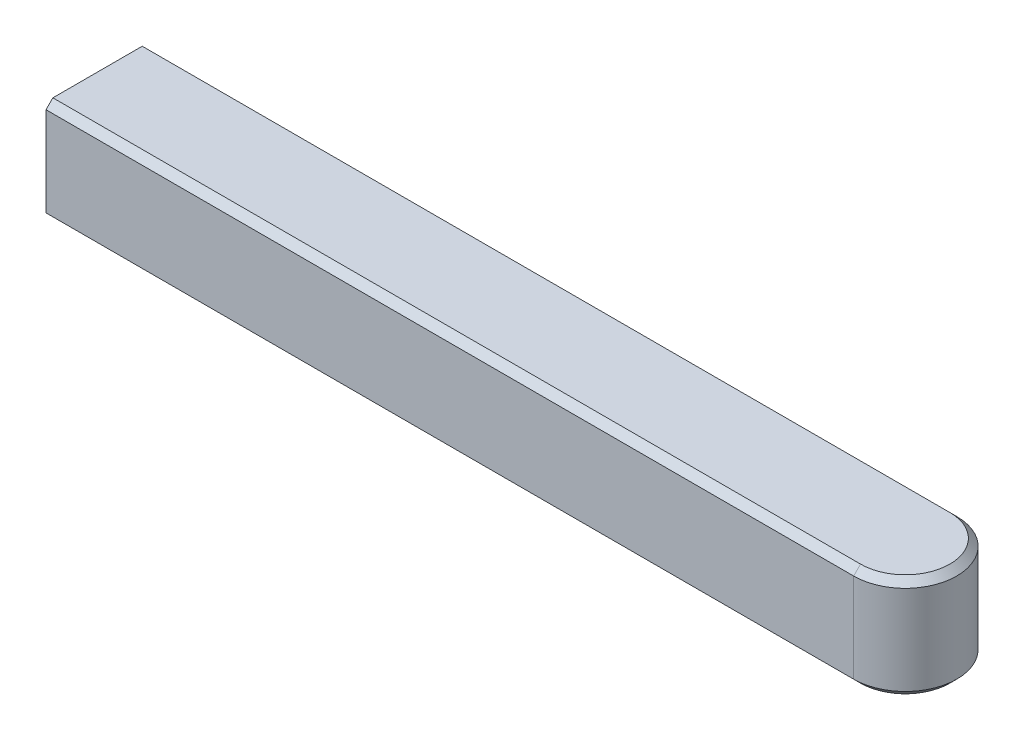
ISO-10303-21;
HEADER;
FILE_DESCRIPTION(('STEP AP214'),'2;1');
FILE_NAME('part.step','',(''),(''),'','','');
FILE_SCHEMA(('AUTOMOTIVE_DESIGN { 1 0 10303 214 1 1 1 1 }'));
ENDSEC;
DATA;
#1=APPLICATION_CONTEXT('core data for automotive mechanical design processes');
#2=APPLICATION_PROTOCOL_DEFINITION('international standard','automotive_design',2000,#1);
#3=PRODUCT_CONTEXT('',#1,'mechanical');
#4=PRODUCT('Part','Part','',(#3));
#5=PRODUCT_RELATED_PRODUCT_CATEGORY('part','',(#4));
#6=PRODUCT_DEFINITION_FORMATION('','',#4);
#7=PRODUCT_DEFINITION_CONTEXT('part definition',#1,'design');
#8=PRODUCT_DEFINITION('design','',#6,#7);
#9=PRODUCT_DEFINITION_SHAPE('','',#8);
#10=(LENGTH_UNIT() NAMED_UNIT(*) SI_UNIT(.MILLI.,.METRE.));
#11=(NAMED_UNIT(*) PLANE_ANGLE_UNIT() SI_UNIT($,.RADIAN.));
#12=(NAMED_UNIT(*) SI_UNIT($,.STERADIAN.) SOLID_ANGLE_UNIT());
#13=UNCERTAINTY_MEASURE_WITH_UNIT(LENGTH_MEASURE(1.E-05),#10,'distance_accuracy_value','');
#14=(GEOMETRIC_REPRESENTATION_CONTEXT(3) GLOBAL_UNCERTAINTY_ASSIGNED_CONTEXT((#13)) GLOBAL_UNIT_ASSIGNED_CONTEXT((#10,
#11,#12)) REPRESENTATION_CONTEXT('',''));
#15=CARTESIAN_POINT('',(0.,0.,0.));
#16=DIRECTION('',(0.,0.,1.));
#17=DIRECTION('',(1.,0.,0.));
#18=AXIS2_PLACEMENT_3D('',#15,#16,#17);
#19=CARTESIAN_POINT('',(11.,0.,0.));
#20=DIRECTION('',(0.,-1.,0.));
#21=DIRECTION('',(0.,0.,-1.));
#22=AXIS2_PLACEMENT_3D('',#19,#20,#21);
#23=CYLINDRICAL_SURFACE('',#22,1.5);
#24=DIRECTION('',(0.,-1.,0.));
#25=VECTOR('',#24,1.);
#26=CARTESIAN_POINT('',(11.,3.,1.5));
#27=LINE('',#26,#25);
#28=CARTESIAN_POINT('',(11.,0.200000000000002,1.5));
#29=VERTEX_POINT('',#28);
#30=CARTESIAN_POINT('',(11.,2.8,1.5));
#31=VERTEX_POINT('',#30);
#32=EDGE_CURVE('E123',#29,#31,#27,.F.);
#33=ORIENTED_EDGE('',*,*,#32,.F.);
#34=CARTESIAN_POINT('',(11.,0.200000000000002,0.));
#35=DIRECTION('',(0.,1.,0.));
#36=DIRECTION('',(0.,0.,1.));
#37=AXIS2_PLACEMENT_3D('',#34,#35,#36);
#38=CIRCLE('',#37,1.5);
#39=CARTESIAN_POINT('',(11.,0.200000000000002,-1.5));
#40=VERTEX_POINT('',#39);
#41=EDGE_CURVE('E122',#29,#40,#38,.T.);
#42=ORIENTED_EDGE('',*,*,#41,.T.);
#43=DIRECTION('',(0.,-1.,0.));
#44=VECTOR('',#43,1.);
#45=CARTESIAN_POINT('',(11.,3.,-1.5));
#46=LINE('',#45,#44);
#47=CARTESIAN_POINT('',(11.,2.8,-1.5));
#48=VERTEX_POINT('',#47);
#49=EDGE_CURVE('E108',#48,#40,#46,.T.);
#50=ORIENTED_EDGE('',*,*,#49,.F.);
#51=CARTESIAN_POINT('',(11.,2.8,0.));
#52=DIRECTION('',(0.,1.,0.));
#53=DIRECTION('',(0.,0.,1.));
#54=AXIS2_PLACEMENT_3D('',#51,#52,#53);
#55=CIRCLE('',#54,1.5);
#56=EDGE_CURVE('E119',#48,#31,#55,.F.);
#57=ORIENTED_EDGE('',*,*,#56,.T.);
#58=EDGE_LOOP('',(#33,#42,#50,#57));
#59=FACE_BOUND('',#58,.T.);
#60=ADVANCED_FACE('F37',(#59),#23,.T.);
#61=CARTESIAN_POINT('',(-12.5,3.,-1.5));
#62=DIRECTION('',(1.,0.,0.));
#63=DIRECTION('',(0.,0.,-1.));
#64=AXIS2_PLACEMENT_3D('',#61,#62,#63);
#65=PLANE('',#64);
#66=DIRECTION('',(0.,-1.,0.));
#67=VECTOR('',#66,1.);
#68=CARTESIAN_POINT('',(-12.5,3.,-1.5));
#69=LINE('',#68,#67);
#70=CARTESIAN_POINT('',(-12.5,2.8,-1.5));
#71=VERTEX_POINT('',#70);
#72=CARTESIAN_POINT('',(-12.5,0.200000000000002,-1.5));
#73=VERTEX_POINT('',#72);
#74=EDGE_CURVE('E111',#71,#73,#69,.T.);
#75=ORIENTED_EDGE('',*,*,#74,.T.);
#76=DIRECTION('',(0.,0.707106781186548,-0.707106781186548));
#77=VECTOR('',#76,1.);
#78=CARTESIAN_POINT('',(-12.5,0.200000000000002,-1.5));
#79=LINE('',#78,#77);
#80=CARTESIAN_POINT('',(-12.5,0.,-1.3));
#81=VERTEX_POINT('',#80);
#82=EDGE_CURVE('E153',#73,#81,#79,.F.);
#83=ORIENTED_EDGE('',*,*,#82,.T.);
#84=DIRECTION('',(0.,0.,1.));
#85=VECTOR('',#84,1.);
#86=CARTESIAN_POINT('',(-12.5,0.,-1.5));
#87=LINE('',#86,#85);
#88=CARTESIAN_POINT('',(-12.5,0.,1.3));
#89=VERTEX_POINT('',#88);
#90=EDGE_CURVE('E138',#81,#89,#87,.T.);
#91=ORIENTED_EDGE('',*,*,#90,.T.);
#92=DIRECTION('',(0.,-0.707106781186548,-0.707106781186548));
#93=VECTOR('',#92,1.);
#94=CARTESIAN_POINT('',(-12.5,0.200000000000002,1.5));
#95=LINE('',#94,#93);
#96=CARTESIAN_POINT('',(-12.5,0.200000000000002,1.5));
#97=VERTEX_POINT('',#96);
#98=EDGE_CURVE('E155',#89,#97,#95,.F.);
#99=ORIENTED_EDGE('',*,*,#98,.T.);
#100=DIRECTION('',(0.,-1.,0.));
#101=VECTOR('',#100,1.);
#102=CARTESIAN_POINT('',(-12.5,3.,1.5));
#103=LINE('',#102,#101);
#104=CARTESIAN_POINT('',(-12.5,2.8,1.5));
#105=VERTEX_POINT('',#104);
#106=EDGE_CURVE('E163',#105,#97,#103,.T.);
#107=ORIENTED_EDGE('',*,*,#106,.F.);
#108=DIRECTION('',(0.,0.707106781186548,-0.707106781186548));
#109=VECTOR('',#108,1.);
#110=CARTESIAN_POINT('',(-12.5,3.,1.3));
#111=LINE('',#110,#109);
#112=CARTESIAN_POINT('',(-12.5,3.,1.3));
#113=VERTEX_POINT('',#112);
#114=EDGE_CURVE('E159',#105,#113,#111,.T.);
#115=ORIENTED_EDGE('',*,*,#114,.T.);
#116=DIRECTION('',(0.,0.,1.));
#117=VECTOR('',#116,1.);
#118=CARTESIAN_POINT('',(-12.5,3.,-1.5));
#119=LINE('',#118,#117);
#120=CARTESIAN_POINT('',(-12.5,3.,-1.3));
#121=VERTEX_POINT('',#120);
#122=EDGE_CURVE('E167',#121,#113,#119,.T.);
#123=ORIENTED_EDGE('',*,*,#122,.F.);
#124=DIRECTION('',(0.,-0.707106781186548,-0.707106781186548));
#125=VECTOR('',#124,1.);
#126=CARTESIAN_POINT('',(-12.5,3.,-1.3));
#127=LINE('',#126,#125);
#128=EDGE_CURVE('E157',#121,#71,#127,.T.);
#129=ORIENTED_EDGE('',*,*,#128,.T.);
#130=EDGE_LOOP('',(#75,#83,#91,#99,#107,#115,#123,#129));
#131=FACE_BOUND('',#130,.T.);
#132=ADVANCED_FACE('F180',(#131),#65,.F.);
#133=CARTESIAN_POINT('',(-12.5,3.,1.5));
#134=DIRECTION('',(0.,0.,-1.));
#135=DIRECTION('',(-1.,0.,0.));
#136=AXIS2_PLACEMENT_3D('',#133,#134,#135);
#137=PLANE('',#136);
#138=ORIENTED_EDGE('',*,*,#106,.T.);
#139=DIRECTION('',(1.,0.,0.));
#140=VECTOR('',#139,1.);
#141=CARTESIAN_POINT('',(-12.5,0.200000000000002,1.5));
#142=LINE('',#141,#140);
#143=EDGE_CURVE('E143',#97,#29,#142,.T.);
#144=ORIENTED_EDGE('',*,*,#143,.T.);
#145=ORIENTED_EDGE('',*,*,#32,.T.);
#146=DIRECTION('',(-1.,0.,0.));
#147=VECTOR('',#146,1.);
#148=CARTESIAN_POINT('',(-12.5,2.8,1.5));
#149=LINE('',#148,#147);
#150=EDGE_CURVE('E145',#31,#105,#149,.T.);
#151=ORIENTED_EDGE('',*,*,#150,.T.);
#152=EDGE_LOOP('',(#138,#144,#145,#151));
#153=FACE_BOUND('',#152,.T.);
#154=ADVANCED_FACE('F178',(#153),#137,.F.);
#155=CARTESIAN_POINT('',(-12.5,3.,-1.5));
#156=DIRECTION('',(0.,0.,1.));
#157=DIRECTION('',(1.,0.,0.));
#158=AXIS2_PLACEMENT_3D('',#155,#156,#157);
#159=PLANE('',#158);
#160=ORIENTED_EDGE('',*,*,#49,.T.);
#161=DIRECTION('',(-1.,0.,0.));
#162=VECTOR('',#161,1.);
#163=CARTESIAN_POINT('',(-12.5,0.200000000000002,-1.5));
#164=LINE('',#163,#162);
#165=EDGE_CURVE('E114',#40,#73,#164,.T.);
#166=ORIENTED_EDGE('',*,*,#165,.T.);
#167=ORIENTED_EDGE('',*,*,#74,.F.);
#168=DIRECTION('',(1.,0.,0.));
#169=VECTOR('',#168,1.);
#170=CARTESIAN_POINT('',(11.,2.8,-1.5));
#171=LINE('',#170,#169);
#172=EDGE_CURVE('E104',#71,#48,#171,.T.);
#173=ORIENTED_EDGE('',*,*,#172,.T.);
#174=EDGE_LOOP('',(#160,#166,#167,#173));
#175=FACE_BOUND('',#174,.T.);
#176=ADVANCED_FACE('F106',(#175),#159,.F.);
#177=CARTESIAN_POINT('',(0.,3.,0.));
#178=DIRECTION('',(0.,1.,0.));
#179=DIRECTION('',(0.,0.,1.));
#180=AXIS2_PLACEMENT_3D('',#177,#178,#179);
#181=PLANE('',#180);
#182=CARTESIAN_POINT('',(11.,3.,0.));
#183=DIRECTION('',(0.,1.,0.));
#184=DIRECTION('',(0.,0.,1.));
#185=AXIS2_PLACEMENT_3D('',#182,#183,#184);
#186=CIRCLE('',#185,1.3);
#187=CARTESIAN_POINT('',(11.,3.,1.3));
#188=VERTEX_POINT('',#187);
#189=CARTESIAN_POINT('',(11.,3.,-1.3));
#190=VERTEX_POINT('',#189);
#191=EDGE_CURVE('E46',#188,#190,#186,.T.);
#192=ORIENTED_EDGE('',*,*,#191,.T.);
#193=DIRECTION('',(-1.,0.,0.));
#194=VECTOR('',#193,1.);
#195=CARTESIAN_POINT('',(-12.5,3.,-1.3));
#196=LINE('',#195,#194);
#197=EDGE_CURVE('E11',#190,#121,#196,.T.);
#198=ORIENTED_EDGE('',*,*,#197,.T.);
#199=ORIENTED_EDGE('',*,*,#122,.T.);
#200=DIRECTION('',(1.,0.,0.));
#201=VECTOR('',#200,1.);
#202=CARTESIAN_POINT('',(11.,3.,1.3));
#203=LINE('',#202,#201);
#204=EDGE_CURVE('E57',#113,#188,#203,.T.);
#205=ORIENTED_EDGE('',*,*,#204,.T.);
#206=EDGE_LOOP('',(#192,#198,#199,#205));
#207=FACE_BOUND('',#206,.T.);
#208=ADVANCED_FACE('F171',(#207),#181,.T.);
#209=CARTESIAN_POINT('',(0.,0.,0.));
#210=DIRECTION('',(0.,1.,0.));
#211=DIRECTION('',(0.,0.,1.));
#212=AXIS2_PLACEMENT_3D('',#209,#210,#211);
#213=PLANE('',#212);
#214=ORIENTED_EDGE('',*,*,#90,.F.);
#215=DIRECTION('',(1.,0.,0.));
#216=VECTOR('',#215,1.);
#217=CARTESIAN_POINT('',(0.,0.,-1.3));
#218=LINE('',#217,#216);
#219=CARTESIAN_POINT('',(11.,0.,-1.3));
#220=VERTEX_POINT('',#219);
#221=EDGE_CURVE('E130',#81,#220,#218,.T.);
#222=ORIENTED_EDGE('',*,*,#221,.T.);
#223=CARTESIAN_POINT('',(11.,0.,0.));
#224=DIRECTION('',(0.,1.,0.));
#225=DIRECTION('',(0.,0.,1.));
#226=AXIS2_PLACEMENT_3D('',#223,#224,#225);
#227=CIRCLE('',#226,1.3);
#228=CARTESIAN_POINT('',(11.,0.,1.3));
#229=VERTEX_POINT('',#228);
#230=EDGE_CURVE('E149',#220,#229,#227,.F.);
#231=ORIENTED_EDGE('',*,*,#230,.T.);
#232=DIRECTION('',(-1.,0.,0.));
#233=VECTOR('',#232,1.);
#234=CARTESIAN_POINT('',(0.,0.,1.3));
#235=LINE('',#234,#233);
#236=EDGE_CURVE('E151',#229,#89,#235,.T.);
#237=ORIENTED_EDGE('',*,*,#236,.T.);
#238=EDGE_LOOP('',(#214,#222,#231,#237));
#239=FACE_BOUND('',#238,.T.);
#240=ADVANCED_FACE('F195',(#239),#213,.F.);
#241=CARTESIAN_POINT('',(-12.5,0.200000000000002,1.5));
#242=DIRECTION('',(0.,0.707106781186547,-0.707106781186547));
#243=DIRECTION('',(1.,0.,0.));
#244=AXIS2_PLACEMENT_3D('',#241,#242,#243);
#245=PLANE('',#244);
#246=ORIENTED_EDGE('',*,*,#98,.F.);
#247=ORIENTED_EDGE('',*,*,#236,.F.);
#248=DIRECTION('',(0.,-0.707106781186547,-0.707106781186547));
#249=VECTOR('',#248,1.);
#250=CARTESIAN_POINT('',(11.,0.200000000000002,1.5));
#251=LINE('',#250,#249);
#252=EDGE_CURVE('E135',#29,#229,#251,.T.);
#253=ORIENTED_EDGE('',*,*,#252,.F.);
#254=ORIENTED_EDGE('',*,*,#143,.F.);
#255=EDGE_LOOP('',(#246,#247,#253,#254));
#256=FACE_BOUND('',#255,.T.);
#257=ADVANCED_FACE('F185',(#256),#245,.F.);
#258=CARTESIAN_POINT('',(11.,0.,0.));
#259=DIRECTION('',(0.,1.,0.));
#260=DIRECTION('',(0.,0.,1.));
#261=AXIS2_PLACEMENT_3D('',#258,#259,#260);
#262=CONICAL_SURFACE('',#261,1.3,0.785398163397448);
#263=ORIENTED_EDGE('',*,*,#252,.T.);
#264=ORIENTED_EDGE('',*,*,#230,.F.);
#265=DIRECTION('',(0.,-0.707106781186547,0.707106781186547));
#266=VECTOR('',#265,1.);
#267=CARTESIAN_POINT('',(11.,0.200000000000002,-1.5));
#268=LINE('',#267,#266);
#269=EDGE_CURVE('E133',#40,#220,#268,.T.);
#270=ORIENTED_EDGE('',*,*,#269,.F.);
#271=ORIENTED_EDGE('',*,*,#41,.F.);
#272=EDGE_LOOP('',(#263,#264,#270,#271));
#273=FACE_BOUND('',#272,.T.);
#274=ADVANCED_FACE('F189',(#273),#262,.T.);
#275=CARTESIAN_POINT('',(-12.5,0.200000000000002,-1.5));
#276=DIRECTION('',(0.,0.707106781186547,0.707106781186547));
#277=DIRECTION('',(-1.,0.,0.));
#278=AXIS2_PLACEMENT_3D('',#275,#276,#277);
#279=PLANE('',#278);
#280=ORIENTED_EDGE('',*,*,#269,.T.);
#281=ORIENTED_EDGE('',*,*,#221,.F.);
#282=ORIENTED_EDGE('',*,*,#82,.F.);
#283=ORIENTED_EDGE('',*,*,#165,.F.);
#284=EDGE_LOOP('',(#280,#281,#282,#283));
#285=FACE_BOUND('',#284,.T.);
#286=ADVANCED_FACE('F193',(#285),#279,.F.);
#287=CARTESIAN_POINT('',(0.,3.,1.3));
#288=DIRECTION('',(0.,0.707106781186547,0.707106781186547));
#289=DIRECTION('',(-1.,0.,0.));
#290=AXIS2_PLACEMENT_3D('',#287,#288,#289);
#291=PLANE('',#290);
#292=ORIENTED_EDGE('',*,*,#114,.F.);
#293=ORIENTED_EDGE('',*,*,#150,.F.);
#294=DIRECTION('',(0.,-0.707106781186547,0.707106781186547));
#295=VECTOR('',#294,1.);
#296=CARTESIAN_POINT('',(11.,3.,1.3));
#297=LINE('',#296,#295);
#298=EDGE_CURVE('E41',#188,#31,#297,.T.);
#299=ORIENTED_EDGE('',*,*,#298,.F.);
#300=ORIENTED_EDGE('',*,*,#204,.F.);
#301=EDGE_LOOP('',(#292,#293,#299,#300));
#302=FACE_BOUND('',#301,.T.);
#303=ADVANCED_FACE('F39',(#302),#291,.T.);
#304=CARTESIAN_POINT('',(11.,3.,0.));
#305=DIRECTION('',(0.,-1.,0.));
#306=DIRECTION('',(0.,0.,-1.));
#307=AXIS2_PLACEMENT_3D('',#304,#305,#306);
#308=CONICAL_SURFACE('',#307,1.3,0.785398163397448);
#309=ORIENTED_EDGE('',*,*,#298,.T.);
#310=ORIENTED_EDGE('',*,*,#56,.F.);
#311=DIRECTION('',(0.,-0.707106781186547,-0.707106781186547));
#312=VECTOR('',#311,1.);
#313=CARTESIAN_POINT('',(11.,3.,-1.3));
#314=LINE('',#313,#312);
#315=EDGE_CURVE('E128',#190,#48,#314,.T.);
#316=ORIENTED_EDGE('',*,*,#315,.F.);
#317=ORIENTED_EDGE('',*,*,#191,.F.);
#318=EDGE_LOOP('',(#309,#310,#316,#317));
#319=FACE_BOUND('',#318,.T.);
#320=ADVANCED_FACE('F127',(#319),#308,.T.);
#321=CARTESIAN_POINT('',(0.,3.,-1.3));
#322=DIRECTION('',(0.,0.707106781186547,-0.707106781186547));
#323=DIRECTION('',(1.,0.,0.));
#324=AXIS2_PLACEMENT_3D('',#321,#322,#323);
#325=PLANE('',#324);
#326=ORIENTED_EDGE('',*,*,#315,.T.);
#327=ORIENTED_EDGE('',*,*,#172,.F.);
#328=ORIENTED_EDGE('',*,*,#128,.F.);
#329=ORIENTED_EDGE('',*,*,#197,.F.);
#330=EDGE_LOOP('',(#326,#327,#328,#329));
#331=FACE_BOUND('',#330,.T.);
#332=ADVANCED_FACE('F132',(#331),#325,.T.);
#333=CLOSED_SHELL('',(#60,#132,#154,#176,#208,#240,#257,#274,#286,#303,#320,#332));
#334=MANIFOLD_SOLID_BREP('B2',#333);
#335=ADVANCED_BREP_SHAPE_REPRESENTATION('',(#18,#334),#14);
#336=SHAPE_DEFINITION_REPRESENTATION(#9,#335);
ENDSEC;
END-ISO-10303-21;
